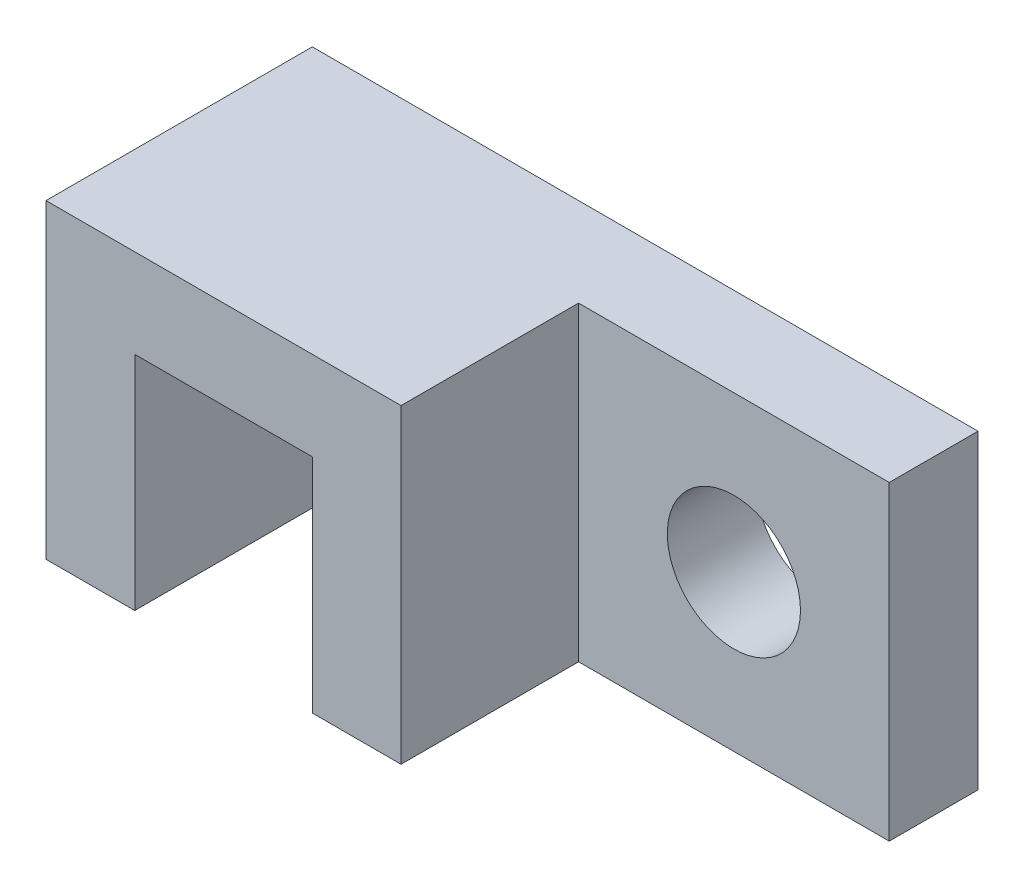
ISO-10303-21;
HEADER;
FILE_DESCRIPTION(('STEP AP214'),'2;1');
FILE_NAME('part.step','',(''),(''),'','','');
FILE_SCHEMA(('AUTOMOTIVE_DESIGN { 1 0 10303 214 1 1 1 1 }'));
ENDSEC;
DATA;
#1=APPLICATION_CONTEXT('core data for automotive mechanical design processes');
#2=APPLICATION_PROTOCOL_DEFINITION('international standard','automotive_design',2000,#1);
#3=PRODUCT_CONTEXT('',#1,'mechanical');
#4=PRODUCT('Part','Part','',(#3));
#5=PRODUCT_RELATED_PRODUCT_CATEGORY('part','',(#4));
#6=PRODUCT_DEFINITION_FORMATION('','',#4);
#7=PRODUCT_DEFINITION_CONTEXT('part definition',#1,'design');
#8=PRODUCT_DEFINITION('design','',#6,#7);
#9=PRODUCT_DEFINITION_SHAPE('','',#8);
#10=(LENGTH_UNIT() NAMED_UNIT(*) SI_UNIT(.MILLI.,.METRE.));
#11=(NAMED_UNIT(*) PLANE_ANGLE_UNIT() SI_UNIT($,.RADIAN.));
#12=(NAMED_UNIT(*) SI_UNIT($,.STERADIAN.) SOLID_ANGLE_UNIT());
#13=UNCERTAINTY_MEASURE_WITH_UNIT(LENGTH_MEASURE(1.E-05),#10,'distance_accuracy_value','');
#14=(GEOMETRIC_REPRESENTATION_CONTEXT(3) GLOBAL_UNCERTAINTY_ASSIGNED_CONTEXT((#13)) GLOBAL_UNIT_ASSIGNED_CONTEXT((#10,
#11,#12)) REPRESENTATION_CONTEXT('',''));
#15=CARTESIAN_POINT('',(0.,0.,0.));
#16=DIRECTION('',(0.,0.,1.));
#17=DIRECTION('',(1.,0.,0.));
#18=AXIS2_PLACEMENT_3D('',#15,#16,#17);
#19=CARTESIAN_POINT('',(0.,35.,30.));
#20=DIRECTION('',(0.,1.,0.));
#21=DIRECTION('',(0.,0.,1.));
#22=AXIS2_PLACEMENT_3D('',#19,#20,#21);
#23=PLANE('',#22);
#24=DIRECTION('',(1.,0.,0.));
#25=VECTOR('',#24,1.);
#26=CARTESIAN_POINT('',(0.,35.,0.));
#27=LINE('',#26,#25);
#28=CARTESIAN_POINT('',(0.,35.,0.));
#29=VERTEX_POINT('',#28);
#30=CARTESIAN_POINT('',(75.,35.,0.));
#31=VERTEX_POINT('',#30);
#32=EDGE_CURVE('E137',#29,#31,#27,.T.);
#33=ORIENTED_EDGE('',*,*,#32,.F.);
#34=DIRECTION('',(0.,0.,-1.));
#35=VECTOR('',#34,1.);
#36=CARTESIAN_POINT('',(0.,35.,30.));
#37=LINE('',#36,#35);
#38=CARTESIAN_POINT('',(0.,35.,30.));
#39=VERTEX_POINT('',#38);
#40=EDGE_CURVE('E11',#39,#29,#37,.T.);
#41=ORIENTED_EDGE('',*,*,#40,.F.);
#42=DIRECTION('',(1.,0.,0.));
#43=VECTOR('',#42,1.);
#44=CARTESIAN_POINT('',(0.,35.,30.));
#45=LINE('',#44,#43);
#46=CARTESIAN_POINT('',(40.,35.,30.));
#47=VERTEX_POINT('',#46);
#48=EDGE_CURVE('E155',#39,#47,#45,.T.);
#49=ORIENTED_EDGE('',*,*,#48,.T.);
#50=DIRECTION('',(0.,0.,-1.));
#51=VECTOR('',#50,1.);
#52=CARTESIAN_POINT('',(40.,35.,30.));
#53=LINE('',#52,#51);
#54=CARTESIAN_POINT('',(40.,35.,9.99999999999999));
#55=VERTEX_POINT('',#54);
#56=EDGE_CURVE('E136',#47,#55,#53,.T.);
#57=ORIENTED_EDGE('',*,*,#56,.T.);
#58=DIRECTION('',(1.,0.,0.));
#59=VECTOR('',#58,1.);
#60=CARTESIAN_POINT('',(0.,35.,10.));
#61=LINE('',#60,#59);
#62=CARTESIAN_POINT('',(75.,35.,10.));
#63=VERTEX_POINT('',#62);
#64=EDGE_CURVE('E50',#55,#63,#61,.T.);
#65=ORIENTED_EDGE('',*,*,#64,.T.);
#66=DIRECTION('',(0.,0.,-1.));
#67=VECTOR('',#66,1.);
#68=CARTESIAN_POINT('',(75.,35.,10.));
#69=LINE('',#68,#67);
#70=EDGE_CURVE('E172',#63,#31,#69,.T.);
#71=ORIENTED_EDGE('',*,*,#70,.T.);
#72=EDGE_LOOP('',(#33,#41,#49,#57,#65,#71));
#73=FACE_BOUND('',#72,.T.);
#74=ADVANCED_FACE('F34',(#73),#23,.T.);
#75=CARTESIAN_POINT('',(0.,0.,30.));
#76=DIRECTION('',(-1.,0.,0.));
#77=DIRECTION('',(0.,0.,1.));
#78=AXIS2_PLACEMENT_3D('',#75,#76,#77);
#79=PLANE('',#78);
#80=DIRECTION('',(0.,1.,0.));
#81=VECTOR('',#80,1.);
#82=CARTESIAN_POINT('',(0.,0.,0.));
#83=LINE('',#82,#81);
#84=CARTESIAN_POINT('',(0.,0.,0.));
#85=VERTEX_POINT('',#84);
#86=EDGE_CURVE('E153',#85,#29,#83,.T.);
#87=ORIENTED_EDGE('',*,*,#86,.F.);
#88=DIRECTION('',(0.,0.,-1.));
#89=VECTOR('',#88,1.);
#90=CARTESIAN_POINT('',(0.,0.,30.));
#91=LINE('',#90,#89);
#92=CARTESIAN_POINT('',(0.,0.,30.));
#93=VERTEX_POINT('',#92);
#94=EDGE_CURVE('E42',#93,#85,#91,.T.);
#95=ORIENTED_EDGE('',*,*,#94,.F.);
#96=DIRECTION('',(0.,1.,0.));
#97=VECTOR('',#96,1.);
#98=CARTESIAN_POINT('',(0.,0.,30.));
#99=LINE('',#98,#97);
#100=EDGE_CURVE('E114',#93,#39,#99,.T.);
#101=ORIENTED_EDGE('',*,*,#100,.T.);
#102=ORIENTED_EDGE('',*,*,#40,.T.);
#103=EDGE_LOOP('',(#87,#95,#101,#102));
#104=FACE_BOUND('',#103,.T.);
#105=ADVANCED_FACE('F232',(#104),#79,.T.);
#106=CARTESIAN_POINT('',(0.,0.,30.));
#107=DIRECTION('',(0.,1.,0.));
#108=DIRECTION('',(0.,0.,1.));
#109=AXIS2_PLACEMENT_3D('',#106,#107,#108);
#110=PLANE('',#109);
#111=DIRECTION('',(1.,0.,0.));
#112=VECTOR('',#111,1.);
#113=CARTESIAN_POINT('',(0.,0.,0.));
#114=LINE('',#113,#112);
#115=CARTESIAN_POINT('',(10.,0.,0.));
#116=VERTEX_POINT('',#115);
#117=EDGE_CURVE('E121',#85,#116,#114,.T.);
#118=ORIENTED_EDGE('',*,*,#117,.T.);
#119=DIRECTION('',(0.,0.,-1.));
#120=VECTOR('',#119,1.);
#121=CARTESIAN_POINT('',(10.,0.,30.));
#122=LINE('',#121,#120);
#123=CARTESIAN_POINT('',(10.,0.,30.));
#124=VERTEX_POINT('',#123);
#125=EDGE_CURVE('E118',#124,#116,#122,.T.);
#126=ORIENTED_EDGE('',*,*,#125,.F.);
#127=DIRECTION('',(1.,0.,0.));
#128=VECTOR('',#127,1.);
#129=CARTESIAN_POINT('',(0.,0.,30.));
#130=LINE('',#129,#128);
#131=EDGE_CURVE('E108',#93,#124,#130,.T.);
#132=ORIENTED_EDGE('',*,*,#131,.F.);
#133=ORIENTED_EDGE('',*,*,#94,.T.);
#134=EDGE_LOOP('',(#118,#126,#132,#133));
#135=FACE_BOUND('',#134,.T.);
#136=ADVANCED_FACE('F119',(#135),#110,.F.);
#137=CARTESIAN_POINT('',(10.,0.,30.));
#138=DIRECTION('',(-1.,0.,0.));
#139=DIRECTION('',(0.,0.,1.));
#140=AXIS2_PLACEMENT_3D('',#137,#138,#139);
#141=PLANE('',#140);
#142=DIRECTION('',(0.,1.,0.));
#143=VECTOR('',#142,1.);
#144=CARTESIAN_POINT('',(10.,0.,0.));
#145=LINE('',#144,#143);
#146=CARTESIAN_POINT('',(10.,25.,0.));
#147=VERTEX_POINT('',#146);
#148=EDGE_CURVE('E150',#116,#147,#145,.T.);
#149=ORIENTED_EDGE('',*,*,#148,.T.);
#150=DIRECTION('',(0.,0.,-1.));
#151=VECTOR('',#150,1.);
#152=CARTESIAN_POINT('',(10.,25.,30.));
#153=LINE('',#152,#151);
#154=CARTESIAN_POINT('',(10.,25.,30.));
#155=VERTEX_POINT('',#154);
#156=EDGE_CURVE('E124',#155,#147,#153,.T.);
#157=ORIENTED_EDGE('',*,*,#156,.F.);
#158=DIRECTION('',(0.,1.,0.));
#159=VECTOR('',#158,1.);
#160=CARTESIAN_POINT('',(10.,0.,30.));
#161=LINE('',#160,#159);
#162=EDGE_CURVE('E112',#124,#155,#161,.T.);
#163=ORIENTED_EDGE('',*,*,#162,.F.);
#164=ORIENTED_EDGE('',*,*,#125,.T.);
#165=EDGE_LOOP('',(#149,#157,#163,#164));
#166=FACE_BOUND('',#165,.T.);
#167=ADVANCED_FACE('F126',(#166),#141,.F.);
#168=CARTESIAN_POINT('',(10.,25.,30.));
#169=DIRECTION('',(0.,1.,0.));
#170=DIRECTION('',(0.,0.,1.));
#171=AXIS2_PLACEMENT_3D('',#168,#169,#170);
#172=PLANE('',#171);
#173=DIRECTION('',(1.,0.,0.));
#174=VECTOR('',#173,1.);
#175=CARTESIAN_POINT('',(10.,25.,0.));
#176=LINE('',#175,#174);
#177=CARTESIAN_POINT('',(30.,25.,0.));
#178=VERTEX_POINT('',#177);
#179=EDGE_CURVE('E147',#147,#178,#176,.T.);
#180=ORIENTED_EDGE('',*,*,#179,.T.);
#181=DIRECTION('',(0.,0.,-1.));
#182=VECTOR('',#181,1.);
#183=CARTESIAN_POINT('',(30.,25.,30.));
#184=LINE('',#183,#182);
#185=CARTESIAN_POINT('',(30.,25.,30.));
#186=VERTEX_POINT('',#185);
#187=EDGE_CURVE('E159',#186,#178,#184,.T.);
#188=ORIENTED_EDGE('',*,*,#187,.F.);
#189=DIRECTION('',(1.,0.,0.));
#190=VECTOR('',#189,1.);
#191=CARTESIAN_POINT('',(10.,25.,30.));
#192=LINE('',#191,#190);
#193=EDGE_CURVE('E129',#155,#186,#192,.T.);
#194=ORIENTED_EDGE('',*,*,#193,.F.);
#195=ORIENTED_EDGE('',*,*,#156,.T.);
#196=EDGE_LOOP('',(#180,#188,#194,#195));
#197=FACE_BOUND('',#196,.T.);
#198=ADVANCED_FACE('F207',(#197),#172,.F.);
#199=CARTESIAN_POINT('',(30.,0.,30.));
#200=DIRECTION('',(-1.,0.,0.));
#201=DIRECTION('',(0.,0.,1.));
#202=AXIS2_PLACEMENT_3D('',#199,#200,#201);
#203=PLANE('',#202);
#204=DIRECTION('',(0.,1.,0.));
#205=VECTOR('',#204,1.);
#206=CARTESIAN_POINT('',(30.,0.,0.));
#207=LINE('',#206,#205);
#208=CARTESIAN_POINT('',(30.,0.,0.));
#209=VERTEX_POINT('',#208);
#210=EDGE_CURVE('E144',#209,#178,#207,.T.);
#211=ORIENTED_EDGE('',*,*,#210,.F.);
#212=DIRECTION('',(0.,0.,-1.));
#213=VECTOR('',#212,1.);
#214=CARTESIAN_POINT('',(30.,0.,30.));
#215=LINE('',#214,#213);
#216=CARTESIAN_POINT('',(30.,0.,30.));
#217=VERTEX_POINT('',#216);
#218=EDGE_CURVE('E161',#217,#209,#215,.T.);
#219=ORIENTED_EDGE('',*,*,#218,.F.);
#220=DIRECTION('',(0.,1.,0.));
#221=VECTOR('',#220,1.);
#222=CARTESIAN_POINT('',(30.,0.,30.));
#223=LINE('',#222,#221);
#224=EDGE_CURVE('E131',#217,#186,#223,.T.);
#225=ORIENTED_EDGE('',*,*,#224,.T.);
#226=ORIENTED_EDGE('',*,*,#187,.T.);
#227=EDGE_LOOP('',(#211,#219,#225,#226));
#228=FACE_BOUND('',#227,.T.);
#229=ADVANCED_FACE('F202',(#228),#203,.T.);
#230=CARTESIAN_POINT('',(30.,0.,30.));
#231=DIRECTION('',(0.,1.,0.));
#232=DIRECTION('',(0.,0.,1.));
#233=AXIS2_PLACEMENT_3D('',#230,#231,#232);
#234=PLANE('',#233);
#235=DIRECTION('',(1.,0.,0.));
#236=VECTOR('',#235,1.);
#237=CARTESIAN_POINT('',(30.,0.,0.));
#238=LINE('',#237,#236);
#239=CARTESIAN_POINT('',(75.,0.,0.));
#240=VERTEX_POINT('',#239);
#241=EDGE_CURVE('E140',#209,#240,#238,.T.);
#242=ORIENTED_EDGE('',*,*,#241,.T.);
#243=DIRECTION('',(0.,0.,-1.));
#244=VECTOR('',#243,1.);
#245=CARTESIAN_POINT('',(75.,0.,10.));
#246=LINE('',#245,#244);
#247=CARTESIAN_POINT('',(75.,0.,10.));
#248=VERTEX_POINT('',#247);
#249=EDGE_CURVE('E141',#248,#240,#246,.T.);
#250=ORIENTED_EDGE('',*,*,#249,.F.);
#251=DIRECTION('',(1.,0.,0.));
#252=VECTOR('',#251,1.);
#253=CARTESIAN_POINT('',(0.,0.,10.));
#254=LINE('',#253,#252);
#255=CARTESIAN_POINT('',(40.,0.,10.));
#256=VERTEX_POINT('',#255);
#257=EDGE_CURVE('E178',#256,#248,#254,.T.);
#258=ORIENTED_EDGE('',*,*,#257,.F.);
#259=DIRECTION('',(0.,0.,-1.));
#260=VECTOR('',#259,1.);
#261=CARTESIAN_POINT('',(40.,0.,30.));
#262=LINE('',#261,#260);
#263=CARTESIAN_POINT('',(40.,0.,30.));
#264=VERTEX_POINT('',#263);
#265=EDGE_CURVE('E163',#264,#256,#262,.T.);
#266=ORIENTED_EDGE('',*,*,#265,.F.);
#267=DIRECTION('',(1.,0.,0.));
#268=VECTOR('',#267,1.);
#269=CARTESIAN_POINT('',(30.,0.,30.));
#270=LINE('',#269,#268);
#271=EDGE_CURVE('E197',#217,#264,#270,.T.);
#272=ORIENTED_EDGE('',*,*,#271,.F.);
#273=ORIENTED_EDGE('',*,*,#218,.T.);
#274=EDGE_LOOP('',(#242,#250,#258,#266,#272,#273));
#275=FACE_BOUND('',#274,.T.);
#276=ADVANCED_FACE('F217',(#275),#234,.F.);
#277=CARTESIAN_POINT('',(40.,0.,30.));
#278=DIRECTION('',(-1.,0.,0.));
#279=DIRECTION('',(0.,0.,1.));
#280=AXIS2_PLACEMENT_3D('',#277,#278,#279);
#281=PLANE('',#280);
#282=ORIENTED_EDGE('',*,*,#265,.T.);
#283=DIRECTION('',(0.,1.,0.));
#284=VECTOR('',#283,1.);
#285=CARTESIAN_POINT('',(40.,0.,10.));
#286=LINE('',#285,#284);
#287=EDGE_CURVE('E176',#256,#55,#286,.T.);
#288=ORIENTED_EDGE('',*,*,#287,.T.);
#289=ORIENTED_EDGE('',*,*,#56,.F.);
#290=DIRECTION('',(0.,1.,0.));
#291=VECTOR('',#290,1.);
#292=CARTESIAN_POINT('',(40.,0.,30.));
#293=LINE('',#292,#291);
#294=EDGE_CURVE('E90',#264,#47,#293,.T.);
#295=ORIENTED_EDGE('',*,*,#294,.F.);
#296=EDGE_LOOP('',(#282,#288,#289,#295));
#297=FACE_BOUND('',#296,.T.);
#298=ADVANCED_FACE('F230',(#297),#281,.F.);
#299=CARTESIAN_POINT('',(0.,0.,30.));
#300=DIRECTION('',(0.,0.,1.));
#301=DIRECTION('',(1.,0.,0.));
#302=AXIS2_PLACEMENT_3D('',#299,#300,#301);
#303=PLANE('',#302);
#304=ORIENTED_EDGE('',*,*,#48,.F.);
#305=ORIENTED_EDGE('',*,*,#100,.F.);
#306=ORIENTED_EDGE('',*,*,#131,.T.);
#307=ORIENTED_EDGE('',*,*,#162,.T.);
#308=ORIENTED_EDGE('',*,*,#193,.T.);
#309=ORIENTED_EDGE('',*,*,#224,.F.);
#310=ORIENTED_EDGE('',*,*,#271,.T.);
#311=ORIENTED_EDGE('',*,*,#294,.T.);
#312=EDGE_LOOP('',(#304,#305,#306,#307,#308,#309,#310,#311));
#313=FACE_BOUND('',#312,.T.);
#314=ADVANCED_FACE('F110',(#313),#303,.T.);
#315=CARTESIAN_POINT('',(0.,0.,0.));
#316=DIRECTION('',(0.,0.,1.));
#317=DIRECTION('',(1.,0.,0.));
#318=AXIS2_PLACEMENT_3D('',#315,#316,#317);
#319=PLANE('',#318);
#320=ORIENTED_EDGE('',*,*,#32,.T.);
#321=DIRECTION('',(0.,-1.,0.));
#322=VECTOR('',#321,1.);
#323=CARTESIAN_POINT('',(75.,0.,0.));
#324=LINE('',#323,#322);
#325=EDGE_CURVE('E188',#31,#240,#324,.T.);
#326=ORIENTED_EDGE('',*,*,#325,.T.);
#327=ORIENTED_EDGE('',*,*,#241,.F.);
#328=ORIENTED_EDGE('',*,*,#210,.T.);
#329=ORIENTED_EDGE('',*,*,#179,.F.);
#330=ORIENTED_EDGE('',*,*,#148,.F.);
#331=ORIENTED_EDGE('',*,*,#117,.F.);
#332=ORIENTED_EDGE('',*,*,#86,.T.);
#333=EDGE_LOOP('',(#320,#326,#327,#328,#329,#330,#331,#332));
#334=FACE_BOUND('',#333,.T.);
#335=CARTESIAN_POINT('',(57.5,17.5,0.));
#336=DIRECTION('',(0.,0.,1.));
#337=DIRECTION('',(1.,0.,0.));
#338=AXIS2_PLACEMENT_3D('',#335,#336,#337);
#339=CIRCLE('',#338,7.5);
#340=CARTESIAN_POINT('',(65.,17.5,0.));
#341=VERTEX_POINT('',#340);
#342=EDGE_CURVE('E185',#341,#341,#339,.T.);
#343=ORIENTED_EDGE('',*,*,#342,.T.);
#344=EDGE_LOOP('',(#343));
#345=FACE_BOUND('',#344,.T.);
#346=ADVANCED_FACE('F211',(#334,#345),#319,.F.);
#347=CARTESIAN_POINT('',(75.,0.,10.));
#348=DIRECTION('',(1.,0.,0.));
#349=DIRECTION('',(0.,0.,-1.));
#350=AXIS2_PLACEMENT_3D('',#347,#348,#349);
#351=PLANE('',#350);
#352=ORIENTED_EDGE('',*,*,#325,.F.);
#353=ORIENTED_EDGE('',*,*,#70,.F.);
#354=DIRECTION('',(0.,-1.,0.));
#355=VECTOR('',#354,1.);
#356=CARTESIAN_POINT('',(75.,0.,10.));
#357=LINE('',#356,#355);
#358=EDGE_CURVE('E173',#63,#248,#357,.T.);
#359=ORIENTED_EDGE('',*,*,#358,.T.);
#360=ORIENTED_EDGE('',*,*,#249,.T.);
#361=EDGE_LOOP('',(#352,#353,#359,#360));
#362=FACE_BOUND('',#361,.T.);
#363=ADVANCED_FACE('F221',(#362),#351,.T.);
#364=CARTESIAN_POINT('',(57.5,17.5,10.));
#365=DIRECTION('',(0.,0.,-1.));
#366=DIRECTION('',(-1.,0.,0.));
#367=AXIS2_PLACEMENT_3D('',#364,#365,#366);
#368=CYLINDRICAL_SURFACE('',#367,7.5);
#369=CARTESIAN_POINT('',(57.5,17.5,10.));
#370=DIRECTION('',(0.,0.,1.));
#371=DIRECTION('',(1.,0.,0.));
#372=AXIS2_PLACEMENT_3D('',#369,#370,#371);
#373=CIRCLE('',#372,7.5);
#374=CARTESIAN_POINT('',(65.,17.5,10.));
#375=VERTEX_POINT('',#374);
#376=EDGE_CURVE('E179',#375,#375,#373,.T.);
#377=ORIENTED_EDGE('',*,*,#376,.T.);
#378=EDGE_LOOP('',(#377));
#379=FACE_BOUND('',#378,.T.);
#380=ORIENTED_EDGE('',*,*,#342,.F.);
#381=EDGE_LOOP('',(#380));
#382=FACE_BOUND('',#381,.T.);
#383=ADVANCED_FACE('F258',(#379,#382),#368,.F.);
#384=CARTESIAN_POINT('',(0.,0.,10.));
#385=DIRECTION('',(0.,0.,1.));
#386=DIRECTION('',(1.,0.,0.));
#387=AXIS2_PLACEMENT_3D('',#384,#385,#386);
#388=PLANE('',#387);
#389=ORIENTED_EDGE('',*,*,#376,.F.);
#390=EDGE_LOOP('',(#389));
#391=FACE_BOUND('',#390,.T.);
#392=ORIENTED_EDGE('',*,*,#287,.F.);
#393=ORIENTED_EDGE('',*,*,#257,.T.);
#394=ORIENTED_EDGE('',*,*,#358,.F.);
#395=ORIENTED_EDGE('',*,*,#64,.F.);
#396=EDGE_LOOP('',(#392,#393,#394,#395));
#397=FACE_BOUND('',#396,.T.);
#398=ADVANCED_FACE('F226',(#391,#397),#388,.T.);
#399=CLOSED_SHELL('',(#74,#105,#136,#167,#198,#229,#276,#298,#314,#346,#363,#383,#398));
#400=MANIFOLD_SOLID_BREP('B2',#399);
#401=ADVANCED_BREP_SHAPE_REPRESENTATION('',(#18,#400),#14);
#402=SHAPE_DEFINITION_REPRESENTATION(#9,#401);
ENDSEC;
END-ISO-10303-21;
